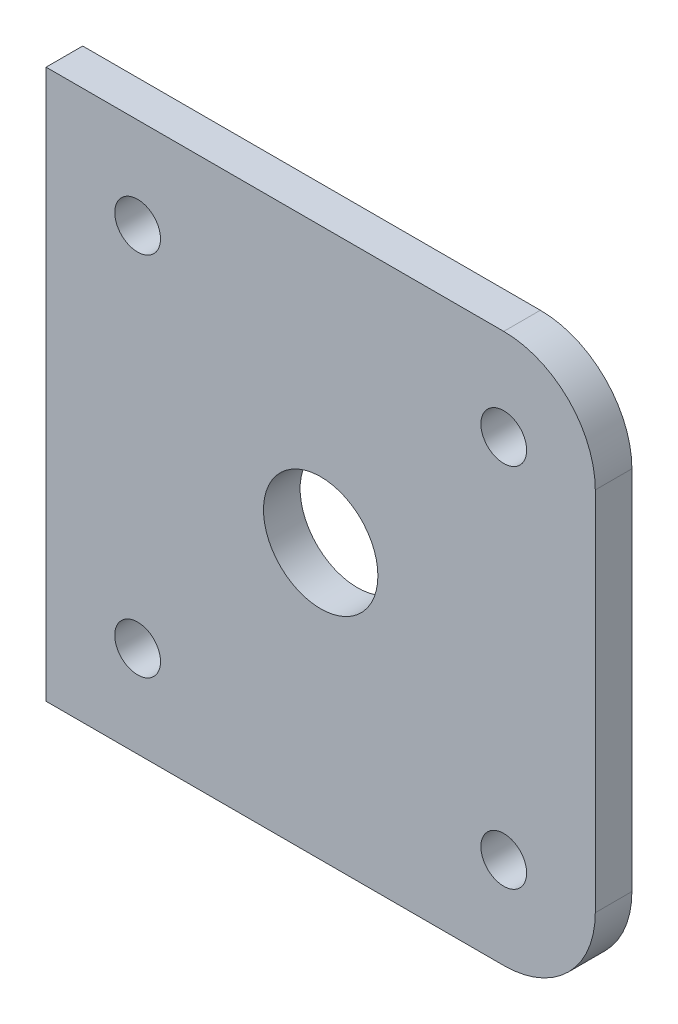
ISO-10303-21;
HEADER;
FILE_DESCRIPTION(('STEP AP214'),'2;1');
FILE_NAME('part.step','',(''),(''),'','','');
FILE_SCHEMA(('AUTOMOTIVE_DESIGN { 1 0 10303 214 1 1 1 1 }'));
ENDSEC;
DATA;
#1=APPLICATION_CONTEXT('core data for automotive mechanical design processes');
#2=APPLICATION_PROTOCOL_DEFINITION('international standard','automotive_design',2000,#1);
#3=PRODUCT_CONTEXT('',#1,'mechanical');
#4=PRODUCT('Part','Part','',(#3));
#5=PRODUCT_RELATED_PRODUCT_CATEGORY('part','',(#4));
#6=PRODUCT_DEFINITION_FORMATION('','',#4);
#7=PRODUCT_DEFINITION_CONTEXT('part definition',#1,'design');
#8=PRODUCT_DEFINITION('design','',#6,#7);
#9=PRODUCT_DEFINITION_SHAPE('','',#8);
#10=(LENGTH_UNIT() NAMED_UNIT(*) SI_UNIT(.MILLI.,.METRE.));
#11=(NAMED_UNIT(*) PLANE_ANGLE_UNIT() SI_UNIT($,.RADIAN.));
#12=(NAMED_UNIT(*) SI_UNIT($,.STERADIAN.) SOLID_ANGLE_UNIT());
#13=UNCERTAINTY_MEASURE_WITH_UNIT(LENGTH_MEASURE(1.E-05),#10,'distance_accuracy_value','');
#14=(GEOMETRIC_REPRESENTATION_CONTEXT(3) GLOBAL_UNCERTAINTY_ASSIGNED_CONTEXT((#13)) GLOBAL_UNIT_ASSIGNED_CONTEXT((#10,
#11,#12)) REPRESENTATION_CONTEXT('',''));
#15=CARTESIAN_POINT('',(0.,0.,0.));
#16=DIRECTION('',(0.,0.,1.));
#17=DIRECTION('',(1.,0.,0.));
#18=AXIS2_PLACEMENT_3D('',#15,#16,#17);
#19=CARTESIAN_POINT('',(40.,-40.,0.));
#20=DIRECTION('',(0.,0.,1.));
#21=DIRECTION('',(1.,0.,0.));
#22=AXIS2_PLACEMENT_3D('',#19,#20,#21);
#23=CYLINDRICAL_SURFACE('',#22,5.00000000000001);
#24=CARTESIAN_POINT('',(40.,-40.,0.));
#25=DIRECTION('',(0.,0.,1.));
#26=DIRECTION('',(1.,0.,0.));
#27=AXIS2_PLACEMENT_3D('',#24,#25,#26);
#28=CIRCLE('',#27,5.00000000000001);
#29=CARTESIAN_POINT('',(45.,-40.,0.));
#30=VERTEX_POINT('',#29);
#31=EDGE_CURVE('E131',#30,#30,#28,.T.);
#32=ORIENTED_EDGE('',*,*,#31,.F.);
#33=EDGE_LOOP('',(#32));
#34=FACE_BOUND('',#33,.T.);
#35=CARTESIAN_POINT('',(40.,-40.,8.));
#36=DIRECTION('',(0.,0.,1.));
#37=DIRECTION('',(1.,0.,0.));
#38=AXIS2_PLACEMENT_3D('',#35,#36,#37);
#39=CIRCLE('',#38,5.00000000000001);
#40=CARTESIAN_POINT('',(45.,-40.,8.));
#41=VERTEX_POINT('',#40);
#42=EDGE_CURVE('E134',#41,#41,#39,.T.);
#43=ORIENTED_EDGE('',*,*,#42,.T.);
#44=EDGE_LOOP('',(#43));
#45=FACE_BOUND('',#44,.T.);
#46=ADVANCED_FACE('F33',(#34,#45),#23,.F.);
#47=CARTESIAN_POINT('',(-40.,-40.,0.));
#48=DIRECTION('',(0.,0.,1.));
#49=DIRECTION('',(1.,0.,0.));
#50=AXIS2_PLACEMENT_3D('',#47,#48,#49);
#51=CYLINDRICAL_SURFACE('',#50,5.00000000000001);
#52=CARTESIAN_POINT('',(-40.,-40.,0.));
#53=DIRECTION('',(0.,0.,1.));
#54=DIRECTION('',(1.,0.,0.));
#55=AXIS2_PLACEMENT_3D('',#52,#53,#54);
#56=CIRCLE('',#55,5.00000000000001);
#57=CARTESIAN_POINT('',(-35.,-40.,0.));
#58=VERTEX_POINT('',#57);
#59=EDGE_CURVE('E107',#58,#58,#56,.T.);
#60=ORIENTED_EDGE('',*,*,#59,.F.);
#61=EDGE_LOOP('',(#60));
#62=FACE_BOUND('',#61,.T.);
#63=CARTESIAN_POINT('',(-40.,-40.,8.));
#64=DIRECTION('',(0.,0.,1.));
#65=DIRECTION('',(1.,0.,0.));
#66=AXIS2_PLACEMENT_3D('',#63,#64,#65);
#67=CIRCLE('',#66,5.00000000000001);
#68=CARTESIAN_POINT('',(-35.,-40.,8.));
#69=VERTEX_POINT('',#68);
#70=EDGE_CURVE('E128',#69,#69,#67,.T.);
#71=ORIENTED_EDGE('',*,*,#70,.T.);
#72=EDGE_LOOP('',(#71));
#73=FACE_BOUND('',#72,.T.);
#74=ADVANCED_FACE('F169',(#62,#73),#51,.F.);
#75=CARTESIAN_POINT('',(60.,-60.,8.));
#76=DIRECTION('',(-1.,0.,0.));
#77=DIRECTION('',(0.,0.,1.));
#78=AXIS2_PLACEMENT_3D('',#75,#76,#77);
#79=PLANE('',#78);
#80=DIRECTION('',(0.,1.,0.));
#81=VECTOR('',#80,1.);
#82=CARTESIAN_POINT('',(60.,-60.,0.));
#83=LINE('',#82,#81);
#84=CARTESIAN_POINT('',(60.,-40.,0.));
#85=VERTEX_POINT('',#84);
#86=CARTESIAN_POINT('',(60.,40.,0.));
#87=VERTEX_POINT('',#86);
#88=EDGE_CURVE('E117',#85,#87,#83,.T.);
#89=ORIENTED_EDGE('',*,*,#88,.T.);
#90=DIRECTION('',(0.,0.,-1.));
#91=VECTOR('',#90,1.);
#92=CARTESIAN_POINT('',(60.,40.,8.));
#93=LINE('',#92,#91);
#94=CARTESIAN_POINT('',(60.,40.,8.));
#95=VERTEX_POINT('',#94);
#96=EDGE_CURVE('E54',#87,#95,#93,.F.);
#97=ORIENTED_EDGE('',*,*,#96,.T.);
#98=DIRECTION('',(0.,1.,0.));
#99=VECTOR('',#98,1.);
#100=CARTESIAN_POINT('',(60.,-60.,8.));
#101=LINE('',#100,#99);
#102=CARTESIAN_POINT('',(60.,-40.,8.));
#103=VERTEX_POINT('',#102);
#104=EDGE_CURVE('E98',#103,#95,#101,.T.);
#105=ORIENTED_EDGE('',*,*,#104,.F.);
#106=DIRECTION('',(0.,0.,-1.));
#107=VECTOR('',#106,1.);
#108=CARTESIAN_POINT('',(60.,-40.,8.));
#109=LINE('',#108,#107);
#110=EDGE_CURVE('E143',#103,#85,#109,.T.);
#111=ORIENTED_EDGE('',*,*,#110,.T.);
#112=EDGE_LOOP('',(#89,#97,#105,#111));
#113=FACE_BOUND('',#112,.T.);
#114=ADVANCED_FACE('F151',(#113),#79,.F.);
#115=CARTESIAN_POINT('',(-60.,60.,8.));
#116=DIRECTION('',(0.,-1.,0.));
#117=DIRECTION('',(0.,0.,-1.));
#118=AXIS2_PLACEMENT_3D('',#115,#116,#117);
#119=PLANE('',#118);
#120=DIRECTION('',(-1.,0.,0.));
#121=VECTOR('',#120,1.);
#122=CARTESIAN_POINT('',(-60.,60.,8.));
#123=LINE('',#122,#121);
#124=CARTESIAN_POINT('',(40.,60.,8.));
#125=VERTEX_POINT('',#124);
#126=CARTESIAN_POINT('',(-60.,60.,8.));
#127=VERTEX_POINT('',#126);
#128=EDGE_CURVE('E87',#125,#127,#123,.T.);
#129=ORIENTED_EDGE('',*,*,#128,.F.);
#130=DIRECTION('',(0.,0.,-1.));
#131=VECTOR('',#130,1.);
#132=CARTESIAN_POINT('',(40.,60.,8.));
#133=LINE('',#132,#131);
#134=CARTESIAN_POINT('',(40.,60.,0.));
#135=VERTEX_POINT('',#134);
#136=EDGE_CURVE('E137',#125,#135,#133,.T.);
#137=ORIENTED_EDGE('',*,*,#136,.T.);
#138=DIRECTION('',(-1.,0.,0.));
#139=VECTOR('',#138,1.);
#140=CARTESIAN_POINT('',(-60.,60.,0.));
#141=LINE('',#140,#139);
#142=CARTESIAN_POINT('',(-60.,60.,0.));
#143=VERTEX_POINT('',#142);
#144=EDGE_CURVE('E104',#135,#143,#141,.T.);
#145=ORIENTED_EDGE('',*,*,#144,.T.);
#146=DIRECTION('',(0.,0.,-1.));
#147=VECTOR('',#146,1.);
#148=CARTESIAN_POINT('',(-60.,60.,8.));
#149=LINE('',#148,#147);
#150=EDGE_CURVE('E101',#127,#143,#149,.T.);
#151=ORIENTED_EDGE('',*,*,#150,.F.);
#152=EDGE_LOOP('',(#129,#137,#145,#151));
#153=FACE_BOUND('',#152,.T.);
#154=ADVANCED_FACE('F102',(#153),#119,.F.);
#155=CARTESIAN_POINT('',(-60.,-60.,8.));
#156=DIRECTION('',(1.,0.,0.));
#157=DIRECTION('',(0.,0.,-1.));
#158=AXIS2_PLACEMENT_3D('',#155,#156,#157);
#159=PLANE('',#158);
#160=DIRECTION('',(0.,-1.,0.));
#161=VECTOR('',#160,1.);
#162=CARTESIAN_POINT('',(-60.,-60.,0.));
#163=LINE('',#162,#161);
#164=CARTESIAN_POINT('',(-60.,-60.,0.));
#165=VERTEX_POINT('',#164);
#166=EDGE_CURVE('E121',#143,#165,#163,.T.);
#167=ORIENTED_EDGE('',*,*,#166,.T.);
#168=DIRECTION('',(0.,0.,-1.));
#169=VECTOR('',#168,1.);
#170=CARTESIAN_POINT('',(-60.,-60.,8.));
#171=LINE('',#170,#169);
#172=CARTESIAN_POINT('',(-60.,-60.,8.));
#173=VERTEX_POINT('',#172);
#174=EDGE_CURVE('E108',#173,#165,#171,.T.);
#175=ORIENTED_EDGE('',*,*,#174,.F.);
#176=DIRECTION('',(0.,-1.,0.));
#177=VECTOR('',#176,1.);
#178=CARTESIAN_POINT('',(-60.,-60.,8.));
#179=LINE('',#178,#177);
#180=EDGE_CURVE('E92',#127,#173,#179,.T.);
#181=ORIENTED_EDGE('',*,*,#180,.F.);
#182=ORIENTED_EDGE('',*,*,#150,.T.);
#183=EDGE_LOOP('',(#167,#175,#181,#182));
#184=FACE_BOUND('',#183,.T.);
#185=ADVANCED_FACE('F110',(#184),#159,.F.);
#186=CARTESIAN_POINT('',(-60.,-60.,8.));
#187=DIRECTION('',(0.,1.,0.));
#188=DIRECTION('',(0.,0.,1.));
#189=AXIS2_PLACEMENT_3D('',#186,#187,#188);
#190=PLANE('',#189);
#191=DIRECTION('',(1.,0.,0.));
#192=VECTOR('',#191,1.);
#193=CARTESIAN_POINT('',(-60.,-60.,0.));
#194=LINE('',#193,#192);
#195=CARTESIAN_POINT('',(40.,-60.,0.));
#196=VERTEX_POINT('',#195);
#197=EDGE_CURVE('E123',#165,#196,#194,.T.);
#198=ORIENTED_EDGE('',*,*,#197,.T.);
#199=DIRECTION('',(0.,0.,-1.));
#200=VECTOR('',#199,1.);
#201=CARTESIAN_POINT('',(40.,-60.,8.));
#202=LINE('',#201,#200);
#203=CARTESIAN_POINT('',(40.,-60.,8.));
#204=VERTEX_POINT('',#203);
#205=EDGE_CURVE('E11',#196,#204,#202,.F.);
#206=ORIENTED_EDGE('',*,*,#205,.T.);
#207=DIRECTION('',(1.,0.,0.));
#208=VECTOR('',#207,1.);
#209=CARTESIAN_POINT('',(-60.,-60.,8.));
#210=LINE('',#209,#208);
#211=EDGE_CURVE('E112',#173,#204,#210,.T.);
#212=ORIENTED_EDGE('',*,*,#211,.F.);
#213=ORIENTED_EDGE('',*,*,#174,.T.);
#214=EDGE_LOOP('',(#198,#206,#212,#213));
#215=FACE_BOUND('',#214,.T.);
#216=ADVANCED_FACE('F157',(#215),#190,.F.);
#217=CARTESIAN_POINT('',(0.,0.,8.));
#218=DIRECTION('',(0.,0.,-1.));
#219=DIRECTION('',(-1.,0.,0.));
#220=AXIS2_PLACEMENT_3D('',#217,#218,#219);
#221=PLANE('',#220);
#222=CARTESIAN_POINT('',(40.,40.,8.));
#223=DIRECTION('',(0.,0.,1.));
#224=DIRECTION('',(1.,0.,0.));
#225=AXIS2_PLACEMENT_3D('',#222,#223,#224);
#226=CIRCLE('',#225,5.00000000000001);
#227=CARTESIAN_POINT('',(45.,40.,8.));
#228=VERTEX_POINT('',#227);
#229=EDGE_CURVE('E223',#228,#228,#226,.T.);
#230=ORIENTED_EDGE('',*,*,#229,.F.);
#231=EDGE_LOOP('',(#230));
#232=FACE_BOUND('',#231,.T.);
#233=CARTESIAN_POINT('',(-40.,40.,8.));
#234=DIRECTION('',(0.,0.,1.));
#235=DIRECTION('',(1.,0.,0.));
#236=AXIS2_PLACEMENT_3D('',#233,#234,#235);
#237=CIRCLE('',#236,5.00000000000001);
#238=CARTESIAN_POINT('',(-35.,40.,8.));
#239=VERTEX_POINT('',#238);
#240=EDGE_CURVE('E220',#239,#239,#237,.T.);
#241=ORIENTED_EDGE('',*,*,#240,.F.);
#242=EDGE_LOOP('',(#241));
#243=FACE_BOUND('',#242,.T.);
#244=CARTESIAN_POINT('',(0.,0.,8.));
#245=DIRECTION('',(0.,0.,1.));
#246=DIRECTION('',(1.,0.,0.));
#247=AXIS2_PLACEMENT_3D('',#244,#245,#246);
#248=CIRCLE('',#247,12.5);
#249=CARTESIAN_POINT('',(12.5,0.,8.));
#250=VERTEX_POINT('',#249);
#251=EDGE_CURVE('E215',#250,#250,#248,.T.);
#252=ORIENTED_EDGE('',*,*,#251,.F.);
#253=EDGE_LOOP('',(#252));
#254=FACE_BOUND('',#253,.T.);
#255=ORIENTED_EDGE('',*,*,#104,.T.);
#256=CARTESIAN_POINT('',(40.,40.,8.));
#257=DIRECTION('',(0.,0.,-1.));
#258=DIRECTION('',(-1.,0.,0.));
#259=AXIS2_PLACEMENT_3D('',#256,#257,#258);
#260=CIRCLE('',#259,20.);
#261=EDGE_CURVE('E41',#95,#125,#260,.F.);
#262=ORIENTED_EDGE('',*,*,#261,.T.);
#263=ORIENTED_EDGE('',*,*,#128,.T.);
#264=ORIENTED_EDGE('',*,*,#180,.T.);
#265=ORIENTED_EDGE('',*,*,#211,.T.);
#266=CARTESIAN_POINT('',(40.,-40.,8.));
#267=DIRECTION('',(0.,0.,-1.));
#268=DIRECTION('',(-1.,0.,0.));
#269=AXIS2_PLACEMENT_3D('',#266,#267,#268);
#270=CIRCLE('',#269,20.);
#271=EDGE_CURVE('E147',#204,#103,#270,.F.);
#272=ORIENTED_EDGE('',*,*,#271,.T.);
#273=EDGE_LOOP('',(#255,#262,#263,#264,#265,#272));
#274=FACE_BOUND('',#273,.T.);
#275=ORIENTED_EDGE('',*,*,#70,.F.);
#276=EDGE_LOOP('',(#275));
#277=FACE_BOUND('',#276,.T.);
#278=ORIENTED_EDGE('',*,*,#42,.F.);
#279=EDGE_LOOP('',(#278));
#280=FACE_BOUND('',#279,.T.);
#281=ADVANCED_FACE('F89',(#232,#243,#254,#274,#277,#280),#221,.F.);
#282=CARTESIAN_POINT('',(0.,0.,0.));
#283=DIRECTION('',(0.,0.,-1.));
#284=DIRECTION('',(-1.,0.,0.));
#285=AXIS2_PLACEMENT_3D('',#282,#283,#284);
#286=PLANE('',#285);
#287=CARTESIAN_POINT('',(40.,40.,0.));
#288=DIRECTION('',(0.,0.,1.));
#289=DIRECTION('',(1.,0.,0.));
#290=AXIS2_PLACEMENT_3D('',#287,#288,#289);
#291=CIRCLE('',#290,5.00000000000001);
#292=CARTESIAN_POINT('',(45.,40.,0.));
#293=VERTEX_POINT('',#292);
#294=EDGE_CURVE('E208',#293,#293,#291,.T.);
#295=ORIENTED_EDGE('',*,*,#294,.T.);
#296=EDGE_LOOP('',(#295));
#297=FACE_BOUND('',#296,.T.);
#298=CARTESIAN_POINT('',(-40.,40.,0.));
#299=DIRECTION('',(0.,0.,1.));
#300=DIRECTION('',(1.,0.,0.));
#301=AXIS2_PLACEMENT_3D('',#298,#299,#300);
#302=CIRCLE('',#301,5.00000000000001);
#303=CARTESIAN_POINT('',(-35.,40.,0.));
#304=VERTEX_POINT('',#303);
#305=EDGE_CURVE('E212',#304,#304,#302,.T.);
#306=ORIENTED_EDGE('',*,*,#305,.T.);
#307=EDGE_LOOP('',(#306));
#308=FACE_BOUND('',#307,.T.);
#309=CARTESIAN_POINT('',(0.,0.,0.));
#310=DIRECTION('',(0.,0.,1.));
#311=DIRECTION('',(1.,0.,0.));
#312=AXIS2_PLACEMENT_3D('',#309,#310,#311);
#313=CIRCLE('',#312,12.5);
#314=CARTESIAN_POINT('',(12.5,0.,0.));
#315=VERTEX_POINT('',#314);
#316=EDGE_CURVE('E119',#315,#315,#313,.T.);
#317=ORIENTED_EDGE('',*,*,#316,.T.);
#318=EDGE_LOOP('',(#317));
#319=FACE_BOUND('',#318,.T.);
#320=ORIENTED_EDGE('',*,*,#144,.F.);
#321=CARTESIAN_POINT('',(40.,40.,0.));
#322=DIRECTION('',(0.,0.,-1.));
#323=DIRECTION('',(-1.,0.,0.));
#324=AXIS2_PLACEMENT_3D('',#321,#322,#323);
#325=CIRCLE('',#324,20.);
#326=EDGE_CURVE('E141',#135,#87,#325,.T.);
#327=ORIENTED_EDGE('',*,*,#326,.T.);
#328=ORIENTED_EDGE('',*,*,#88,.F.);
#329=CARTESIAN_POINT('',(40.,-40.,0.));
#330=DIRECTION('',(0.,0.,-1.));
#331=DIRECTION('',(-1.,0.,0.));
#332=AXIS2_PLACEMENT_3D('',#329,#330,#331);
#333=CIRCLE('',#332,20.);
#334=EDGE_CURVE('E139',#85,#196,#333,.T.);
#335=ORIENTED_EDGE('',*,*,#334,.T.);
#336=ORIENTED_EDGE('',*,*,#197,.F.);
#337=ORIENTED_EDGE('',*,*,#166,.F.);
#338=EDGE_LOOP('',(#320,#327,#328,#335,#336,#337));
#339=FACE_BOUND('',#338,.T.);
#340=ORIENTED_EDGE('',*,*,#59,.T.);
#341=EDGE_LOOP('',(#340));
#342=FACE_BOUND('',#341,.T.);
#343=ORIENTED_EDGE('',*,*,#31,.T.);
#344=EDGE_LOOP('',(#343));
#345=FACE_BOUND('',#344,.T.);
#346=ADVANCED_FACE('F155',(#297,#308,#319,#339,#342,#345),#286,.T.);
#347=CARTESIAN_POINT('',(0.,0.,0.));
#348=DIRECTION('',(0.,0.,1.));
#349=DIRECTION('',(1.,0.,0.));
#350=AXIS2_PLACEMENT_3D('',#347,#348,#349);
#351=CYLINDRICAL_SURFACE('',#350,12.5);
#352=ORIENTED_EDGE('',*,*,#316,.F.);
#353=EDGE_LOOP('',(#352));
#354=FACE_BOUND('',#353,.T.);
#355=ORIENTED_EDGE('',*,*,#251,.T.);
#356=EDGE_LOOP('',(#355));
#357=FACE_BOUND('',#356,.T.);
#358=ADVANCED_FACE('F194',(#354,#357),#351,.F.);
#359=CARTESIAN_POINT('',(-40.,40.,0.));
#360=DIRECTION('',(0.,0.,1.));
#361=DIRECTION('',(1.,0.,0.));
#362=AXIS2_PLACEMENT_3D('',#359,#360,#361);
#363=CYLINDRICAL_SURFACE('',#362,5.00000000000001);
#364=ORIENTED_EDGE('',*,*,#305,.F.);
#365=EDGE_LOOP('',(#364));
#366=FACE_BOUND('',#365,.T.);
#367=ORIENTED_EDGE('',*,*,#240,.T.);
#368=EDGE_LOOP('',(#367));
#369=FACE_BOUND('',#368,.T.);
#370=ADVANCED_FACE('F188',(#366,#369),#363,.F.);
#371=CARTESIAN_POINT('',(40.,40.,0.));
#372=DIRECTION('',(0.,0.,1.));
#373=DIRECTION('',(1.,0.,0.));
#374=AXIS2_PLACEMENT_3D('',#371,#372,#373);
#375=CYLINDRICAL_SURFACE('',#374,5.00000000000001);
#376=ORIENTED_EDGE('',*,*,#294,.F.);
#377=EDGE_LOOP('',(#376));
#378=FACE_BOUND('',#377,.T.);
#379=ORIENTED_EDGE('',*,*,#229,.T.);
#380=EDGE_LOOP('',(#379));
#381=FACE_BOUND('',#380,.T.);
#382=ADVANCED_FACE('F182',(#378,#381),#375,.F.);
#383=CARTESIAN_POINT('',(40.,40.,8.));
#384=DIRECTION('',(0.,0.,-1.));
#385=DIRECTION('',(-1.,0.,0.));
#386=AXIS2_PLACEMENT_3D('',#383,#384,#385);
#387=CYLINDRICAL_SURFACE('',#386,20.);
#388=ORIENTED_EDGE('',*,*,#261,.F.);
#389=ORIENTED_EDGE('',*,*,#96,.F.);
#390=ORIENTED_EDGE('',*,*,#326,.F.);
#391=ORIENTED_EDGE('',*,*,#136,.F.);
#392=EDGE_LOOP('',(#388,#389,#390,#391));
#393=FACE_BOUND('',#392,.T.);
#394=ADVANCED_FACE('F180',(#393),#387,.T.);
#395=CARTESIAN_POINT('',(40.,-40.,8.));
#396=DIRECTION('',(0.,0.,-1.));
#397=DIRECTION('',(-1.,0.,0.));
#398=AXIS2_PLACEMENT_3D('',#395,#396,#397);
#399=CYLINDRICAL_SURFACE('',#398,20.);
#400=ORIENTED_EDGE('',*,*,#271,.F.);
#401=ORIENTED_EDGE('',*,*,#205,.F.);
#402=ORIENTED_EDGE('',*,*,#334,.F.);
#403=ORIENTED_EDGE('',*,*,#110,.F.);
#404=EDGE_LOOP('',(#400,#401,#402,#403));
#405=FACE_BOUND('',#404,.T.);
#406=ADVANCED_FACE('F35',(#405),#399,.T.);
#407=CLOSED_SHELL('',(#46,#74,#114,#154,#185,#216,#281,#346,#358,#370,#382,#394,#406));
#408=MANIFOLD_SOLID_BREP('B2',#407);
#409=ADVANCED_BREP_SHAPE_REPRESENTATION('',(#18,#408),#14);
#410=SHAPE_DEFINITION_REPRESENTATION(#9,#409);
ENDSEC;
END-ISO-10303-21;
